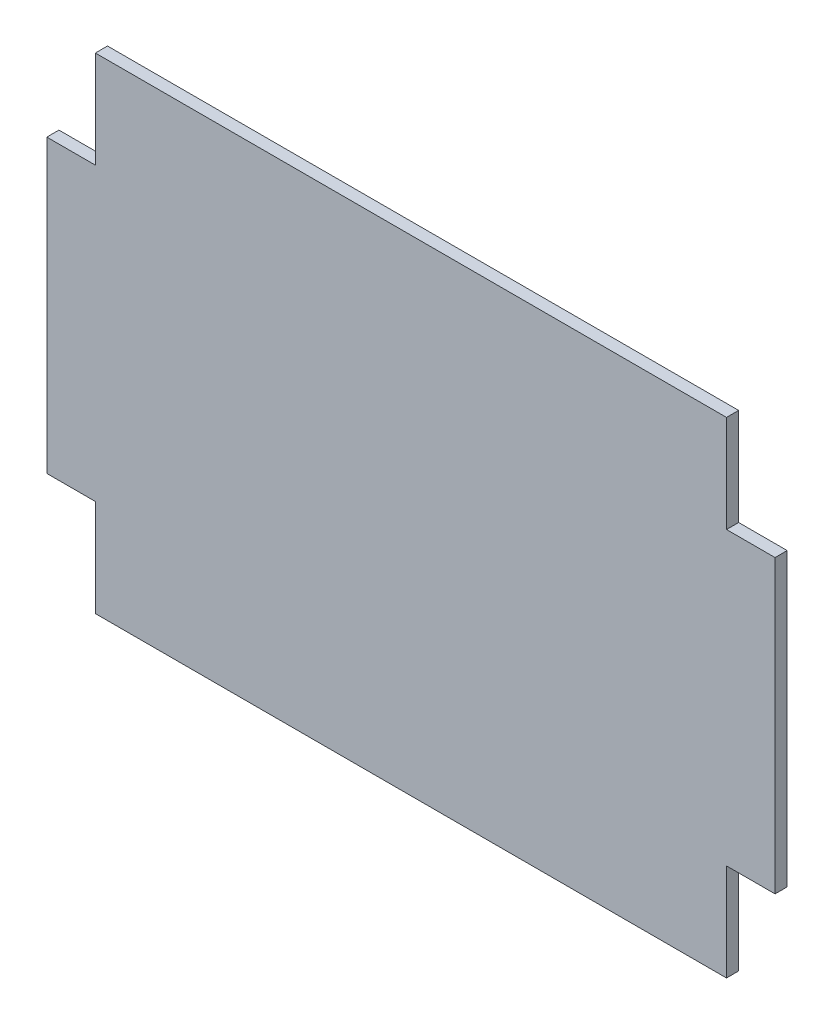
ISO-10303-21;
HEADER;
FILE_DESCRIPTION(('STEP AP214'),'2;1');
FILE_NAME('part.step','',(''),(''),'','','');
FILE_SCHEMA(('AUTOMOTIVE_DESIGN { 1 0 10303 214 1 1 1 1 }'));
ENDSEC;
DATA;
#1=APPLICATION_CONTEXT('core data for automotive mechanical design processes');
#2=APPLICATION_PROTOCOL_DEFINITION('international standard','automotive_design',2000,#1);
#3=PRODUCT_CONTEXT('',#1,'mechanical');
#4=PRODUCT('Part','Part','',(#3));
#5=PRODUCT_RELATED_PRODUCT_CATEGORY('part','',(#4));
#6=PRODUCT_DEFINITION_FORMATION('','',#4);
#7=PRODUCT_DEFINITION_CONTEXT('part definition',#1,'design');
#8=PRODUCT_DEFINITION('design','',#6,#7);
#9=PRODUCT_DEFINITION_SHAPE('','',#8);
#10=(LENGTH_UNIT() NAMED_UNIT(*) SI_UNIT(.MILLI.,.METRE.));
#11=(NAMED_UNIT(*) PLANE_ANGLE_UNIT() SI_UNIT($,.RADIAN.));
#12=(NAMED_UNIT(*) SI_UNIT($,.STERADIAN.) SOLID_ANGLE_UNIT());
#13=UNCERTAINTY_MEASURE_WITH_UNIT(LENGTH_MEASURE(1.E-05),#10,'distance_accuracy_value','');
#14=(GEOMETRIC_REPRESENTATION_CONTEXT(3) GLOBAL_UNCERTAINTY_ASSIGNED_CONTEXT((#13)) GLOBAL_UNIT_ASSIGNED_CONTEXT((#10,
#11,#12)) REPRESENTATION_CONTEXT('',''));
#15=CARTESIAN_POINT('',(0.,0.,0.));
#16=DIRECTION('',(0.,0.,1.));
#17=DIRECTION('',(1.,0.,0.));
#18=AXIS2_PLACEMENT_3D('',#15,#16,#17);
#19=CARTESIAN_POINT('',(150.,100.,5.));
#20=DIRECTION('',(-1.,0.,0.));
#21=DIRECTION('',(0.,-1.,0.));
#22=AXIS2_PLACEMENT_3D('',#19,#20,#21);
#23=PLANE('',#22);
#24=DIRECTION('',(0.,1.,0.));
#25=VECTOR('',#24,1.);
#26=CARTESIAN_POINT('',(150.,100.,5.));
#27=LINE('',#26,#25);
#28=CARTESIAN_POINT('',(150.,-60.,5.));
#29=VERTEX_POINT('',#28);
#30=CARTESIAN_POINT('',(150.,60.,5.));
#31=VERTEX_POINT('',#30);
#32=EDGE_CURVE('E205',#29,#31,#27,.T.);
#33=ORIENTED_EDGE('',*,*,#32,.F.);
#34=DIRECTION('',(0.,0.,-1.));
#35=VECTOR('',#34,1.);
#36=CARTESIAN_POINT('',(150.,-60.,10.));
#37=LINE('',#36,#35);
#38=CARTESIAN_POINT('',(150.,-60.,0.));
#39=VERTEX_POINT('',#38);
#40=EDGE_CURVE('E145',#29,#39,#37,.T.);
#41=ORIENTED_EDGE('',*,*,#40,.T.);
#42=DIRECTION('',(0.,1.,0.));
#43=VECTOR('',#42,1.);
#44=CARTESIAN_POINT('',(150.,100.,0.));
#45=LINE('',#44,#43);
#46=CARTESIAN_POINT('',(150.,60.,0.));
#47=VERTEX_POINT('',#46);
#48=EDGE_CURVE('E149',#39,#47,#45,.T.);
#49=ORIENTED_EDGE('',*,*,#48,.T.);
#50=DIRECTION('',(0.,0.,1.));
#51=VECTOR('',#50,1.);
#52=CARTESIAN_POINT('',(150.,60.,0.));
#53=LINE('',#52,#51);
#54=EDGE_CURVE('E173',#47,#31,#53,.T.);
#55=ORIENTED_EDGE('',*,*,#54,.T.);
#56=EDGE_LOOP('',(#33,#41,#49,#55));
#57=FACE_BOUND('',#56,.T.);
#58=ADVANCED_FACE('F35',(#57),#23,.F.);
#59=CARTESIAN_POINT('',(-150.,100.,5.));
#60=DIRECTION('',(0.,-1.,0.));
#61=DIRECTION('',(0.,0.,-1.));
#62=AXIS2_PLACEMENT_3D('',#59,#60,#61);
#63=PLANE('',#62);
#64=DIRECTION('',(-1.,0.,0.));
#65=VECTOR('',#64,1.);
#66=CARTESIAN_POINT('',(-150.,100.,5.));
#67=LINE('',#66,#65);
#68=CARTESIAN_POINT('',(130.,100.,5.));
#69=VERTEX_POINT('',#68);
#70=CARTESIAN_POINT('',(-130.,100.,5.));
#71=VERTEX_POINT('',#70);
#72=EDGE_CURVE('E207',#69,#71,#67,.T.);
#73=ORIENTED_EDGE('',*,*,#72,.F.);
#74=DIRECTION('',(0.,0.,1.));
#75=VECTOR('',#74,1.);
#76=CARTESIAN_POINT('',(130.,100.,0.));
#77=LINE('',#76,#75);
#78=CARTESIAN_POINT('',(130.,100.,0.));
#79=VERTEX_POINT('',#78);
#80=EDGE_CURVE('E187',#79,#69,#77,.T.);
#81=ORIENTED_EDGE('',*,*,#80,.F.);
#82=DIRECTION('',(-1.,0.,0.));
#83=VECTOR('',#82,1.);
#84=CARTESIAN_POINT('',(-150.,100.,0.));
#85=LINE('',#84,#83);
#86=CARTESIAN_POINT('',(-130.,100.,0.));
#87=VERTEX_POINT('',#86);
#88=EDGE_CURVE('E213',#79,#87,#85,.T.);
#89=ORIENTED_EDGE('',*,*,#88,.T.);
#90=DIRECTION('',(0.,0.,1.));
#91=VECTOR('',#90,1.);
#92=CARTESIAN_POINT('',(-130.,100.,0.));
#93=LINE('',#92,#91);
#94=EDGE_CURVE('E175',#87,#71,#93,.T.);
#95=ORIENTED_EDGE('',*,*,#94,.T.);
#96=EDGE_LOOP('',(#73,#81,#89,#95));
#97=FACE_BOUND('',#96,.T.);
#98=ADVANCED_FACE('F245',(#97),#63,.F.);
#99=CARTESIAN_POINT('',(-150.,100.,5.));
#100=DIRECTION('',(1.,0.,0.));
#101=DIRECTION('',(0.,1.,0.));
#102=AXIS2_PLACEMENT_3D('',#99,#100,#101);
#103=PLANE('',#102);
#104=DIRECTION('',(0.,-1.,0.));
#105=VECTOR('',#104,1.);
#106=CARTESIAN_POINT('',(-150.,100.,0.));
#107=LINE('',#106,#105);
#108=CARTESIAN_POINT('',(-150.,60.,0.));
#109=VERTEX_POINT('',#108);
#110=CARTESIAN_POINT('',(-150.,-60.,0.));
#111=VERTEX_POINT('',#110);
#112=EDGE_CURVE('E215',#109,#111,#107,.T.);
#113=ORIENTED_EDGE('',*,*,#112,.T.);
#114=DIRECTION('',(0.,0.,-1.));
#115=VECTOR('',#114,1.);
#116=CARTESIAN_POINT('',(-150.,-60.,10.));
#117=LINE('',#116,#115);
#118=CARTESIAN_POINT('',(-150.,-60.,5.));
#119=VERTEX_POINT('',#118);
#120=EDGE_CURVE('E153',#119,#111,#117,.T.);
#121=ORIENTED_EDGE('',*,*,#120,.F.);
#122=DIRECTION('',(0.,-1.,0.));
#123=VECTOR('',#122,1.);
#124=CARTESIAN_POINT('',(-150.,100.,5.));
#125=LINE('',#124,#123);
#126=CARTESIAN_POINT('',(-150.,60.,5.));
#127=VERTEX_POINT('',#126);
#128=EDGE_CURVE('E43',#127,#119,#125,.T.);
#129=ORIENTED_EDGE('',*,*,#128,.F.);
#130=DIRECTION('',(0.,0.,1.));
#131=VECTOR('',#130,1.);
#132=CARTESIAN_POINT('',(-150.,60.,0.));
#133=LINE('',#132,#131);
#134=EDGE_CURVE('E169',#109,#127,#133,.T.);
#135=ORIENTED_EDGE('',*,*,#134,.F.);
#136=EDGE_LOOP('',(#113,#121,#129,#135));
#137=FACE_BOUND('',#136,.T.);
#138=ADVANCED_FACE('F234',(#137),#103,.F.);
#139=CARTESIAN_POINT('',(-150.,-100.,5.));
#140=DIRECTION('',(0.,1.,0.));
#141=DIRECTION('',(0.,0.,1.));
#142=AXIS2_PLACEMENT_3D('',#139,#140,#141);
#143=PLANE('',#142);
#144=DIRECTION('',(1.,0.,0.));
#145=VECTOR('',#144,1.);
#146=CARTESIAN_POINT('',(-150.,-100.,0.));
#147=LINE('',#146,#145);
#148=CARTESIAN_POINT('',(-130.,-100.,0.));
#149=VERTEX_POINT('',#148);
#150=CARTESIAN_POINT('',(130.,-100.,0.));
#151=VERTEX_POINT('',#150);
#152=EDGE_CURVE('E38',#149,#151,#147,.T.);
#153=ORIENTED_EDGE('',*,*,#152,.T.);
#154=DIRECTION('',(0.,0.,1.));
#155=VECTOR('',#154,1.);
#156=CARTESIAN_POINT('',(130.,-100.,0.));
#157=LINE('',#156,#155);
#158=CARTESIAN_POINT('',(130.,-100.,5.));
#159=VERTEX_POINT('',#158);
#160=EDGE_CURVE('E131',#151,#159,#157,.T.);
#161=ORIENTED_EDGE('',*,*,#160,.T.);
#162=DIRECTION('',(1.,0.,0.));
#163=VECTOR('',#162,1.);
#164=CARTESIAN_POINT('',(-150.,-100.,5.));
#165=LINE('',#164,#163);
#166=CARTESIAN_POINT('',(-130.,-100.,5.));
#167=VERTEX_POINT('',#166);
#168=EDGE_CURVE('E11',#167,#159,#165,.T.);
#169=ORIENTED_EDGE('',*,*,#168,.F.);
#170=DIRECTION('',(0.,0.,1.));
#171=VECTOR('',#170,1.);
#172=CARTESIAN_POINT('',(-130.,-100.,0.));
#173=LINE('',#172,#171);
#174=EDGE_CURVE('E202',#149,#167,#173,.T.);
#175=ORIENTED_EDGE('',*,*,#174,.F.);
#176=EDGE_LOOP('',(#153,#161,#169,#175));
#177=FACE_BOUND('',#176,.T.);
#178=ADVANCED_FACE('F223',(#177),#143,.F.);
#179=CARTESIAN_POINT('',(0.,0.,5.));
#180=DIRECTION('',(0.,0.,1.));
#181=DIRECTION('',(1.,0.,0.));
#182=AXIS2_PLACEMENT_3D('',#179,#180,#181);
#183=PLANE('',#182);
#184=DIRECTION('',(0.,-1.,0.));
#185=VECTOR('',#184,1.);
#186=CARTESIAN_POINT('',(130.,-100.,5.));
#187=LINE('',#186,#185);
#188=CARTESIAN_POINT('',(130.,-60.,5.));
#189=VERTEX_POINT('',#188);
#190=EDGE_CURVE('E136',#189,#159,#187,.T.);
#191=ORIENTED_EDGE('',*,*,#190,.F.);
#192=DIRECTION('',(-1.,0.,0.));
#193=VECTOR('',#192,1.);
#194=CARTESIAN_POINT('',(0.,-60.,5.));
#195=LINE('',#194,#193);
#196=EDGE_CURVE('E144',#29,#189,#195,.T.);
#197=ORIENTED_EDGE('',*,*,#196,.F.);
#198=ORIENTED_EDGE('',*,*,#32,.T.);
#199=DIRECTION('',(1.,0.,0.));
#200=VECTOR('',#199,1.);
#201=CARTESIAN_POINT('',(150.,60.,5.));
#202=LINE('',#201,#200);
#203=CARTESIAN_POINT('',(130.,60.,5.));
#204=VERTEX_POINT('',#203);
#205=EDGE_CURVE('E185',#204,#31,#202,.T.);
#206=ORIENTED_EDGE('',*,*,#205,.F.);
#207=DIRECTION('',(0.,-1.,0.));
#208=VECTOR('',#207,1.);
#209=CARTESIAN_POINT('',(130.,100.,5.));
#210=LINE('',#209,#208);
#211=EDGE_CURVE('E188',#69,#204,#210,.T.);
#212=ORIENTED_EDGE('',*,*,#211,.F.);
#213=ORIENTED_EDGE('',*,*,#72,.T.);
#214=DIRECTION('',(0.,1.,0.));
#215=VECTOR('',#214,1.);
#216=CARTESIAN_POINT('',(-130.,100.,5.));
#217=LINE('',#216,#215);
#218=CARTESIAN_POINT('',(-130.,60.,5.));
#219=VERTEX_POINT('',#218);
#220=EDGE_CURVE('E167',#219,#71,#217,.T.);
#221=ORIENTED_EDGE('',*,*,#220,.F.);
#222=DIRECTION('',(1.,0.,0.));
#223=VECTOR('',#222,1.);
#224=CARTESIAN_POINT('',(-150.,60.,5.));
#225=LINE('',#224,#223);
#226=EDGE_CURVE('E170',#127,#219,#225,.T.);
#227=ORIENTED_EDGE('',*,*,#226,.F.);
#228=ORIENTED_EDGE('',*,*,#128,.T.);
#229=DIRECTION('',(-1.,0.,0.));
#230=VECTOR('',#229,1.);
#231=CARTESIAN_POINT('',(0.,-60.,5.));
#232=LINE('',#231,#230);
#233=CARTESIAN_POINT('',(-130.,-60.,5.));
#234=VERTEX_POINT('',#233);
#235=EDGE_CURVE('E156',#234,#119,#232,.T.);
#236=ORIENTED_EDGE('',*,*,#235,.F.);
#237=DIRECTION('',(0.,1.,0.));
#238=VECTOR('',#237,1.);
#239=CARTESIAN_POINT('',(-130.,-100.,5.));
#240=LINE('',#239,#238);
#241=EDGE_CURVE('E178',#167,#234,#240,.T.);
#242=ORIENTED_EDGE('',*,*,#241,.F.);
#243=ORIENTED_EDGE('',*,*,#168,.T.);
#244=EDGE_LOOP('',(#191,#197,#198,#206,#212,#213,#221,#227,#228,#236,#242,#243));
#245=FACE_BOUND('',#244,.T.);
#246=ADVANCED_FACE('F237',(#245),#183,.T.);
#247=CARTESIAN_POINT('',(0.,0.,0.));
#248=DIRECTION('',(0.,0.,1.));
#249=DIRECTION('',(1.,0.,0.));
#250=AXIS2_PLACEMENT_3D('',#247,#248,#249);
#251=PLANE('',#250);
#252=DIRECTION('',(1.,0.,0.));
#253=VECTOR('',#252,1.);
#254=CARTESIAN_POINT('',(130.,-60.,0.));
#255=LINE('',#254,#253);
#256=CARTESIAN_POINT('',(130.,-60.,0.));
#257=VERTEX_POINT('',#256);
#258=EDGE_CURVE('E141',#257,#39,#255,.T.);
#259=ORIENTED_EDGE('',*,*,#258,.F.);
#260=DIRECTION('',(0.,-1.,0.));
#261=VECTOR('',#260,1.);
#262=CARTESIAN_POINT('',(130.,-100.,0.));
#263=LINE('',#262,#261);
#264=EDGE_CURVE('E126',#257,#151,#263,.T.);
#265=ORIENTED_EDGE('',*,*,#264,.T.);
#266=ORIENTED_EDGE('',*,*,#152,.F.);
#267=DIRECTION('',(0.,1.,0.));
#268=VECTOR('',#267,1.);
#269=CARTESIAN_POINT('',(-130.,-100.,0.));
#270=LINE('',#269,#268);
#271=CARTESIAN_POINT('',(-130.,-60.,0.));
#272=VERTEX_POINT('',#271);
#273=EDGE_CURVE('E200',#149,#272,#270,.T.);
#274=ORIENTED_EDGE('',*,*,#273,.T.);
#275=DIRECTION('',(1.,0.,0.));
#276=VECTOR('',#275,1.);
#277=CARTESIAN_POINT('',(-130.,-60.,0.));
#278=LINE('',#277,#276);
#279=EDGE_CURVE('E158',#111,#272,#278,.T.);
#280=ORIENTED_EDGE('',*,*,#279,.F.);
#281=ORIENTED_EDGE('',*,*,#112,.F.);
#282=DIRECTION('',(1.,0.,0.));
#283=VECTOR('',#282,1.);
#284=CARTESIAN_POINT('',(-150.,60.,0.));
#285=LINE('',#284,#283);
#286=CARTESIAN_POINT('',(-130.,60.,0.));
#287=VERTEX_POINT('',#286);
#288=EDGE_CURVE('E164',#109,#287,#285,.T.);
#289=ORIENTED_EDGE('',*,*,#288,.T.);
#290=DIRECTION('',(0.,1.,0.));
#291=VECTOR('',#290,1.);
#292=CARTESIAN_POINT('',(-130.,100.,0.));
#293=LINE('',#292,#291);
#294=EDGE_CURVE('E59',#287,#87,#293,.T.);
#295=ORIENTED_EDGE('',*,*,#294,.T.);
#296=ORIENTED_EDGE('',*,*,#88,.F.);
#297=DIRECTION('',(0.,-1.,0.));
#298=VECTOR('',#297,1.);
#299=CARTESIAN_POINT('',(130.,100.,0.));
#300=LINE('',#299,#298);
#301=CARTESIAN_POINT('',(130.,60.,0.));
#302=VERTEX_POINT('',#301);
#303=EDGE_CURVE('E182',#79,#302,#300,.T.);
#304=ORIENTED_EDGE('',*,*,#303,.T.);
#305=DIRECTION('',(1.,0.,0.));
#306=VECTOR('',#305,1.);
#307=CARTESIAN_POINT('',(150.,60.,0.));
#308=LINE('',#307,#306);
#309=EDGE_CURVE('E51',#302,#47,#308,.T.);
#310=ORIENTED_EDGE('',*,*,#309,.T.);
#311=ORIENTED_EDGE('',*,*,#48,.F.);
#312=EDGE_LOOP('',(#259,#265,#266,#274,#280,#281,#289,#295,#296,#304,#310,#311));
#313=FACE_BOUND('',#312,.T.);
#314=ADVANCED_FACE('F148',(#313),#251,.F.);
#315=CARTESIAN_POINT('',(-130.,-100.,0.));
#316=DIRECTION('',(1.,0.,0.));
#317=DIRECTION('',(0.,0.,-1.));
#318=AXIS2_PLACEMENT_3D('',#315,#316,#317);
#319=PLANE('',#318);
#320=ORIENTED_EDGE('',*,*,#241,.T.);
#321=DIRECTION('',(0.,0.,-1.));
#322=VECTOR('',#321,1.);
#323=CARTESIAN_POINT('',(-130.,-60.,10.));
#324=LINE('',#323,#322);
#325=EDGE_CURVE('E150',#234,#272,#324,.T.);
#326=ORIENTED_EDGE('',*,*,#325,.T.);
#327=ORIENTED_EDGE('',*,*,#273,.F.);
#328=ORIENTED_EDGE('',*,*,#174,.T.);
#329=EDGE_LOOP('',(#320,#326,#327,#328));
#330=FACE_BOUND('',#329,.T.);
#331=ADVANCED_FACE('F228',(#330),#319,.F.);
#332=CARTESIAN_POINT('',(-130.,100.,0.));
#333=DIRECTION('',(1.,0.,0.));
#334=DIRECTION('',(0.,0.,-1.));
#335=AXIS2_PLACEMENT_3D('',#332,#333,#334);
#336=PLANE('',#335);
#337=ORIENTED_EDGE('',*,*,#220,.T.);
#338=ORIENTED_EDGE('',*,*,#94,.F.);
#339=ORIENTED_EDGE('',*,*,#294,.F.);
#340=DIRECTION('',(0.,0.,1.));
#341=VECTOR('',#340,1.);
#342=CARTESIAN_POINT('',(-130.,60.,0.));
#343=LINE('',#342,#341);
#344=EDGE_CURVE('E179',#287,#219,#343,.T.);
#345=ORIENTED_EDGE('',*,*,#344,.T.);
#346=EDGE_LOOP('',(#337,#338,#339,#345));
#347=FACE_BOUND('',#346,.T.);
#348=ADVANCED_FACE('F270',(#347),#336,.F.);
#349=CARTESIAN_POINT('',(-150.,60.,0.));
#350=DIRECTION('',(0.,-1.,0.));
#351=DIRECTION('',(0.,0.,-1.));
#352=AXIS2_PLACEMENT_3D('',#349,#350,#351);
#353=PLANE('',#352);
#354=ORIENTED_EDGE('',*,*,#226,.T.);
#355=ORIENTED_EDGE('',*,*,#344,.F.);
#356=ORIENTED_EDGE('',*,*,#288,.F.);
#357=ORIENTED_EDGE('',*,*,#134,.T.);
#358=EDGE_LOOP('',(#354,#355,#356,#357));
#359=FACE_BOUND('',#358,.T.);
#360=ADVANCED_FACE('F240',(#359),#353,.F.);
#361=CARTESIAN_POINT('',(150.,60.,0.));
#362=DIRECTION('',(0.,-1.,0.));
#363=DIRECTION('',(0.,0.,-1.));
#364=AXIS2_PLACEMENT_3D('',#361,#362,#363);
#365=PLANE('',#364);
#366=ORIENTED_EDGE('',*,*,#205,.T.);
#367=ORIENTED_EDGE('',*,*,#54,.F.);
#368=ORIENTED_EDGE('',*,*,#309,.F.);
#369=DIRECTION('',(0.,0.,1.));
#370=VECTOR('',#369,1.);
#371=CARTESIAN_POINT('',(130.,60.,0.));
#372=LINE('',#371,#370);
#373=EDGE_CURVE('E195',#302,#204,#372,.T.);
#374=ORIENTED_EDGE('',*,*,#373,.T.);
#375=EDGE_LOOP('',(#366,#367,#368,#374));
#376=FACE_BOUND('',#375,.T.);
#377=ADVANCED_FACE('F251',(#376),#365,.F.);
#378=CARTESIAN_POINT('',(130.,100.,0.));
#379=DIRECTION('',(-1.,0.,0.));
#380=DIRECTION('',(0.,0.,1.));
#381=AXIS2_PLACEMENT_3D('',#378,#379,#380);
#382=PLANE('',#381);
#383=ORIENTED_EDGE('',*,*,#211,.T.);
#384=ORIENTED_EDGE('',*,*,#373,.F.);
#385=ORIENTED_EDGE('',*,*,#303,.F.);
#386=ORIENTED_EDGE('',*,*,#80,.T.);
#387=EDGE_LOOP('',(#383,#384,#385,#386));
#388=FACE_BOUND('',#387,.T.);
#389=ADVANCED_FACE('F248',(#388),#382,.F.);
#390=CARTESIAN_POINT('',(130.,-100.,0.));
#391=DIRECTION('',(-1.,0.,0.));
#392=DIRECTION('',(0.,0.,1.));
#393=AXIS2_PLACEMENT_3D('',#390,#391,#392);
#394=PLANE('',#393);
#395=ORIENTED_EDGE('',*,*,#190,.T.);
#396=ORIENTED_EDGE('',*,*,#160,.F.);
#397=ORIENTED_EDGE('',*,*,#264,.F.);
#398=DIRECTION('',(0.,0.,-1.));
#399=VECTOR('',#398,1.);
#400=CARTESIAN_POINT('',(130.,-60.,10.));
#401=LINE('',#400,#399);
#402=EDGE_CURVE('E129',#189,#257,#401,.T.);
#403=ORIENTED_EDGE('',*,*,#402,.F.);
#404=EDGE_LOOP('',(#395,#396,#397,#403));
#405=FACE_BOUND('',#404,.T.);
#406=ADVANCED_FACE('F128',(#405),#394,.F.);
#407=CARTESIAN_POINT('',(130.,-60.,10.));
#408=DIRECTION('',(0.,1.,0.));
#409=DIRECTION('',(-1.,0.,0.));
#410=AXIS2_PLACEMENT_3D('',#407,#408,#409);
#411=PLANE('',#410);
#412=ORIENTED_EDGE('',*,*,#196,.T.);
#413=ORIENTED_EDGE('',*,*,#402,.T.);
#414=ORIENTED_EDGE('',*,*,#258,.T.);
#415=ORIENTED_EDGE('',*,*,#40,.F.);
#416=EDGE_LOOP('',(#412,#413,#414,#415));
#417=FACE_BOUND('',#416,.T.);
#418=ADVANCED_FACE('F140',(#417),#411,.F.);
#419=CARTESIAN_POINT('',(-130.,-60.,10.));
#420=DIRECTION('',(0.,1.,0.));
#421=DIRECTION('',(0.,0.,1.));
#422=AXIS2_PLACEMENT_3D('',#419,#420,#421);
#423=PLANE('',#422);
#424=ORIENTED_EDGE('',*,*,#235,.T.);
#425=ORIENTED_EDGE('',*,*,#120,.T.);
#426=ORIENTED_EDGE('',*,*,#279,.T.);
#427=ORIENTED_EDGE('',*,*,#325,.F.);
#428=EDGE_LOOP('',(#424,#425,#426,#427));
#429=FACE_BOUND('',#428,.T.);
#430=ADVANCED_FACE('F232',(#429),#423,.F.);
#431=CLOSED_SHELL('',(#58,#98,#138,#178,#246,#314,#331,#348,#360,#377,#389,#406,#418,#430));
#432=MANIFOLD_SOLID_BREP('B2',#431);
#433=ADVANCED_BREP_SHAPE_REPRESENTATION('',(#18,#432),#14);
#434=SHAPE_DEFINITION_REPRESENTATION(#9,#433);
ENDSEC;
END-ISO-10303-21;
